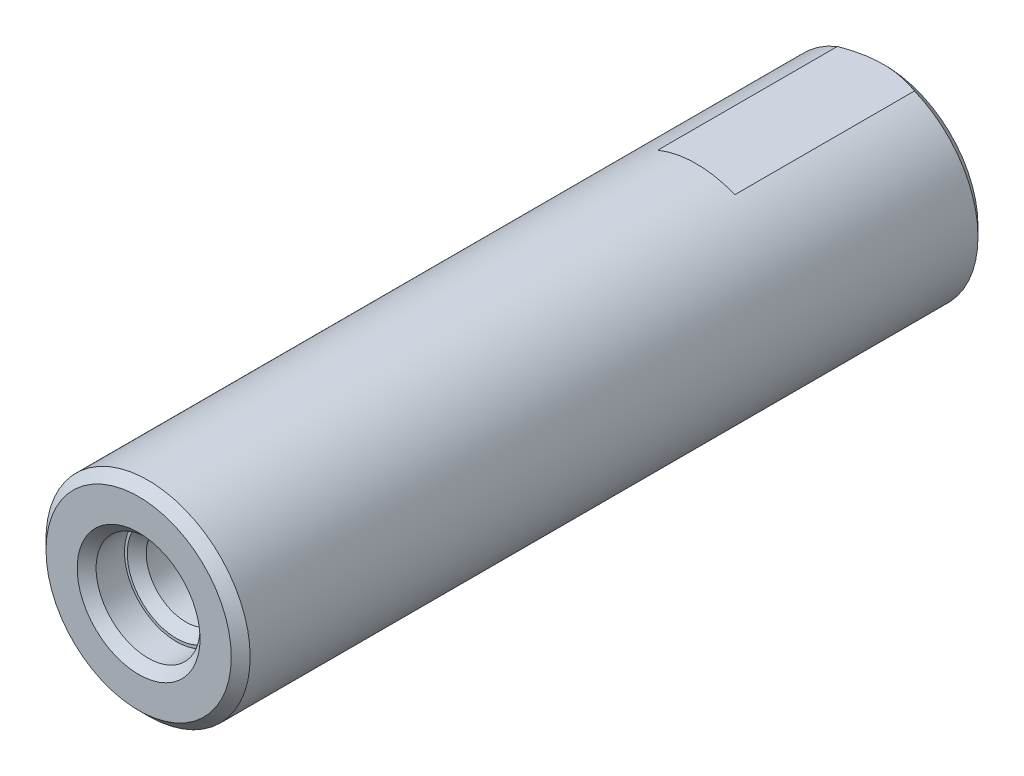
ISO-10303-21;
HEADER;
FILE_DESCRIPTION(('STEP AP214'),'2;1');
FILE_NAME('part.step','',(''),(''),'','','');
FILE_SCHEMA(('AUTOMOTIVE_DESIGN { 1 0 10303 214 1 1 1 1 }'));
ENDSEC;
DATA;
#1=APPLICATION_CONTEXT('core data for automotive mechanical design processes');
#2=APPLICATION_PROTOCOL_DEFINITION('international standard','automotive_design',2000,#1);
#3=PRODUCT_CONTEXT('',#1,'mechanical');
#4=PRODUCT('Part','Part','',(#3));
#5=PRODUCT_RELATED_PRODUCT_CATEGORY('part','',(#4));
#6=PRODUCT_DEFINITION_FORMATION('','',#4);
#7=PRODUCT_DEFINITION_CONTEXT('part definition',#1,'design');
#8=PRODUCT_DEFINITION('design','',#6,#7);
#9=PRODUCT_DEFINITION_SHAPE('','',#8);
#10=(LENGTH_UNIT() NAMED_UNIT(*) SI_UNIT(.MILLI.,.METRE.));
#11=(NAMED_UNIT(*) PLANE_ANGLE_UNIT() SI_UNIT($,.RADIAN.));
#12=(NAMED_UNIT(*) SI_UNIT($,.STERADIAN.) SOLID_ANGLE_UNIT());
#13=UNCERTAINTY_MEASURE_WITH_UNIT(LENGTH_MEASURE(1.E-05),#10,'distance_accuracy_value','');
#14=(GEOMETRIC_REPRESENTATION_CONTEXT(3) GLOBAL_UNCERTAINTY_ASSIGNED_CONTEXT((#13)) GLOBAL_UNIT_ASSIGNED_CONTEXT((#10,
#11,#12)) REPRESENTATION_CONTEXT('',''));
#15=CARTESIAN_POINT('',(0.,0.,0.));
#16=DIRECTION('',(0.,0.,1.));
#17=DIRECTION('',(1.,0.,0.));
#18=AXIS2_PLACEMENT_3D('',#15,#16,#17);
#19=CARTESIAN_POINT('',(0.,0.,39.5));
#20=DIRECTION('',(0.,0.,-1.));
#21=DIRECTION('',(-1.,0.,0.));
#22=AXIS2_PLACEMENT_3D('',#19,#20,#21);
#23=CYLINDRICAL_SURFACE('',#22,5.4);
#24=CARTESIAN_POINT('',(0.,0.,39.));
#25=DIRECTION('',(0.,0.,1.));
#26=DIRECTION('',(1.,0.,0.));
#27=AXIS2_PLACEMENT_3D('',#24,#25,#26);
#28=CIRCLE('',#27,5.4);
#29=CARTESIAN_POINT('',(5.4,0.,39.));
#30=VERTEX_POINT('',#29);
#31=EDGE_CURVE('E118',#30,#30,#28,.F.);
#32=ORIENTED_EDGE('',*,*,#31,.T.);
#33=EDGE_LOOP('',(#32));
#34=FACE_BOUND('',#33,.T.);
#35=CARTESIAN_POINT('',(0.,0.,10.));
#36=DIRECTION('',(0.,0.,1.));
#37=DIRECTION('',(1.,0.,0.));
#38=AXIS2_PLACEMENT_3D('',#35,#36,#37);
#39=CIRCLE('',#38,5.4);
#40=CARTESIAN_POINT('',(-2.03960780543711,-5.,10.));
#41=VERTEX_POINT('',#40);
#42=CARTESIAN_POINT('',(2.03960780543711,-5.,10.));
#43=VERTEX_POINT('',#42);
#44=EDGE_CURVE('E11',#41,#43,#39,.T.);
#45=ORIENTED_EDGE('',*,*,#44,.T.);
#46=DIRECTION('',(0.,0.,-1.));
#47=VECTOR('',#46,1.);
#48=CARTESIAN_POINT('',(2.03960780543711,-5.,39.5));
#49=LINE('',#48,#47);
#50=CARTESIAN_POINT('',(2.03960780543711,-5.,0.500000000000005));
#51=VERTEX_POINT('',#50);
#52=EDGE_CURVE('E90',#43,#51,#49,.T.);
#53=ORIENTED_EDGE('',*,*,#52,.T.);
#54=CARTESIAN_POINT('',(0.,0.,0.500000000000004));
#55=DIRECTION('',(0.,0.,1.));
#56=DIRECTION('',(1.,0.,0.));
#57=AXIS2_PLACEMENT_3D('',#54,#55,#56);
#58=CIRCLE('',#57,5.4);
#59=CARTESIAN_POINT('',(2.03960780543711,5.,0.500000000000004));
#60=VERTEX_POINT('',#59);
#61=EDGE_CURVE('E61',#51,#60,#58,.T.);
#62=ORIENTED_EDGE('',*,*,#61,.T.);
#63=DIRECTION('',(0.,0.,-1.));
#64=VECTOR('',#63,1.);
#65=CARTESIAN_POINT('',(2.03960780543711,5.,39.5));
#66=LINE('',#65,#64);
#67=CARTESIAN_POINT('',(2.03960780543711,5.,10.));
#68=VERTEX_POINT('',#67);
#69=EDGE_CURVE('E104',#68,#60,#66,.T.);
#70=ORIENTED_EDGE('',*,*,#69,.F.);
#71=CARTESIAN_POINT('',(0.,0.,10.));
#72=DIRECTION('',(0.,0.,1.));
#73=DIRECTION('',(1.,0.,0.));
#74=AXIS2_PLACEMENT_3D('',#71,#72,#73);
#75=CIRCLE('',#74,5.4);
#76=CARTESIAN_POINT('',(-2.03960780543711,5.,10.));
#77=VERTEX_POINT('',#76);
#78=EDGE_CURVE('E151',#68,#77,#75,.T.);
#79=ORIENTED_EDGE('',*,*,#78,.T.);
#80=DIRECTION('',(0.,0.,-1.));
#81=VECTOR('',#80,1.);
#82=CARTESIAN_POINT('',(-2.03960780543711,5.,39.5));
#83=LINE('',#82,#81);
#84=CARTESIAN_POINT('',(-2.03960780543711,5.,0.500000000000004));
#85=VERTEX_POINT('',#84);
#86=EDGE_CURVE('E102',#85,#77,#83,.F.);
#87=ORIENTED_EDGE('',*,*,#86,.F.);
#88=CARTESIAN_POINT('',(-2.03960780543711,-5.,0.500000000000004));
#89=VERTEX_POINT('',#88);
#90=EDGE_CURVE('E95',#85,#89,#58,.T.);
#91=ORIENTED_EDGE('',*,*,#90,.T.);
#92=DIRECTION('',(0.,0.,-1.));
#93=VECTOR('',#92,1.);
#94=CARTESIAN_POINT('',(-2.03960780543711,-5.,39.5));
#95=LINE('',#94,#93);
#96=EDGE_CURVE('E53',#89,#41,#95,.F.);
#97=ORIENTED_EDGE('',*,*,#96,.T.);
#98=EDGE_LOOP('',(#45,#53,#62,#70,#79,#87,#91,#97));
#99=FACE_BOUND('',#98,.T.);
#100=ADVANCED_FACE('F38',(#34,#99),#23,.T.);
#101=CARTESIAN_POINT('',(0.,0.,0.500000000000004));
#102=DIRECTION('',(0.,0.,1.));
#103=DIRECTION('',(1.,0.,0.));
#104=AXIS2_PLACEMENT_3D('',#101,#102,#103);
#105=CONICAL_SURFACE('',#104,5.4,0.78539816339745);
#106=CARTESIAN_POINT('',(-3.55844793750582,-5.,1.23698229783494));
#107=CARTESIAN_POINT('',(-3.46862853281629,-5.,1.18490731578521));
#108=CARTESIAN_POINT('',(-3.37824708377922,-5.,1.13380360024076));
#109=CARTESIAN_POINT('',(-3.19623728614932,-5.,1.03381290104912));
#110=CARTESIAN_POINT('',(-3.10460862260931,-5.,0.984926491343645));
#111=CARTESIAN_POINT('',(-2.82702617390308,-5.,0.841677345323222));
#112=CARTESIAN_POINT('',(-2.63906658882332,-5.,0.751130536360762));
#113=CARTESIAN_POINT('',(-2.2542695508479,-5.,0.581916277053992));
#114=CARTESIAN_POINT('',(-2.05733888313538,-5.,0.503458458257279));
#115=CARTESIAN_POINT('',(-1.65751480131661,-5.,0.364256266708928));
#116=CARTESIAN_POINT('',(-1.45463196493869,-5.,0.303482344961023));
#117=CARTESIAN_POINT('',(-1.1246661128785,-5.,0.223502518929508));
#118=CARTESIAN_POINT('',(-0.999254136032922,-5.,0.197356244040857));
#119=CARTESIAN_POINT('',(-0.746871571155798,-5.,0.153946873610009));
#120=CARTESIAN_POINT('',(-0.619900907762319,-5.,0.136684209332924));
#121=CARTESIAN_POINT('',(-0.366074762066631,-5.,0.111805570168607));
#122=CARTESIAN_POINT('',(-0.239227094519322,-5.,0.10411060550821));
#123=CARTESIAN_POINT('',(0.0146882198085563,-5.,0.0984099621337339));
#124=CARTESIAN_POINT('',(0.141755871556907,-5.,0.100404505162544));
#125=CARTESIAN_POINT('',(0.414831894586561,-5.,0.115054400963582));
#126=CARTESIAN_POINT('',(0.560756443216524,-5.,0.129297800581305));
#127=CARTESIAN_POINT('',(0.850917867372854,-5.,0.169851883898827));
#128=CARTESIAN_POINT('',(0.995154397995769,-5.,0.196164991066866));
#129=CARTESIAN_POINT('',(1.28296336382971,-5.,0.260043725859942));
#130=CARTESIAN_POINT('',(1.42650538133624,-5.,0.297744851612287));
#131=CARTESIAN_POINT('',(1.7106338804291,-5.,0.382791524768694));
#132=CARTESIAN_POINT('',(1.85122096385268,-5.,0.43013508686298));
#133=CARTESIAN_POINT('',(2.17064155139046,-5.,0.548264489050554));
#134=CARTESIAN_POINT('',(2.34843963453477,-5.,0.621837222432528));
#135=CARTESIAN_POINT('',(2.69916966120001,-5.,0.779875127886667));
#136=CARTESIAN_POINT('',(2.87209891120534,-5.,0.864346190248948));
#137=CARTESIAN_POINT('',(3.21409157523968,-5.,1.04213553536569));
#138=CARTESIAN_POINT('',(3.38313912228282,-5.,1.1354841027797));
#139=CARTESIAN_POINT('',(3.71726244007845,-5.,1.32892384637746));
#140=CARTESIAN_POINT('',(3.88233894061284,-5.,1.429013770616));
#141=CARTESIAN_POINT('',(4.20141944792185,-5.,1.6297230724747));
#142=CARTESIAN_POINT('',(4.35557911866461,-5.,1.73009626769985));
#143=CARTESIAN_POINT('',(4.66125946164193,-5.,1.93479801264583));
#144=CARTESIAN_POINT('',(4.81277991763842,-5.,2.03912688426202));
#145=CARTESIAN_POINT('',(5.11224654466352,-5.,2.2500941666337));
#146=CARTESIAN_POINT('',(5.2602122658097,-5.,2.35670492382206));
#147=CARTESIAN_POINT('',(5.55416329412854,-5.,2.57254212643724));
#148=CARTESIAN_POINT('',(5.70014913316774,-5.,2.68176784668034));
#149=CARTESIAN_POINT('',(5.84531484286475,-5.,2.7920547067877));
#150=B_SPLINE_CURVE_WITH_KNOTS('',3,(#106,#107,#108,#109,#110,#111,#112,#113,#114,#115,#116,
#117,#118,#119,#120,#121,#122,#123,#124,#125,#126,#127,#128,#129,#130,#131,#132,#133,#134,#135,
#136,#137,#138,#139,#140,#141,#142,#143,#144,#145,#146,#147,#148,#149),.UNSPECIFIED.,.F.,.F.,(4,
2,2,2,2,2,2,2,2,2,2,2,2,2,2,2,2,2,2,2,2,4),(0.,0.31145870764884,0.622997580473992,
1.2484757186856,1.88380812576862,2.51807274309482,2.90212477400917,3.28619544741343,
3.66707375996795,4.04796078890492,4.48726123245069,4.92664992146676,5.3714875598596,
5.81623370173471,6.39300615892288,6.97009166426403,7.54922173529123,8.1282445503775,
8.68004167511713,9.23188379943467,9.77896995199092,10.3259061044887),.UNSPECIFIED.);
#151=EDGE_CURVE('E46',#89,#51,#150,.T.);
#152=ORIENTED_EDGE('',*,*,#151,.F.);
#153=ORIENTED_EDGE('',*,*,#90,.F.);
#154=CARTESIAN_POINT('',(-3.55844793750582,5.,1.23698229783494));
#155=CARTESIAN_POINT('',(-3.46862853281629,5.,1.18490731578521));
#156=CARTESIAN_POINT('',(-3.37824708377922,5.,1.13380360024076));
#157=CARTESIAN_POINT('',(-3.19623728614932,5.,1.03381290104912));
#158=CARTESIAN_POINT('',(-3.10460862260931,5.,0.984926491343645));
#159=CARTESIAN_POINT('',(-2.82702617390308,5.,0.841677345323222));
#160=CARTESIAN_POINT('',(-2.63906658882332,5.,0.751130536360762));
#161=CARTESIAN_POINT('',(-2.2542695508479,5.,0.581916277053992));
#162=CARTESIAN_POINT('',(-2.05733888313538,5.,0.503458458257279));
#163=CARTESIAN_POINT('',(-1.65751480131661,5.,0.364256266708928));
#164=CARTESIAN_POINT('',(-1.45463196493869,5.,0.303482344961023));
#165=CARTESIAN_POINT('',(-1.1246661128785,5.,0.223502518929508));
#166=CARTESIAN_POINT('',(-0.999254136032922,5.,0.197356244040857));
#167=CARTESIAN_POINT('',(-0.746871571155798,5.,0.153946873610009));
#168=CARTESIAN_POINT('',(-0.619900907762319,5.,0.136684209332924));
#169=CARTESIAN_POINT('',(-0.366074762066631,5.,0.111805570168607));
#170=CARTESIAN_POINT('',(-0.239227094519322,5.,0.10411060550821));
#171=CARTESIAN_POINT('',(0.0146882198085563,5.,0.0984099621337339));
#172=CARTESIAN_POINT('',(0.141755871556907,5.,0.100404505162544));
#173=CARTESIAN_POINT('',(0.414831894586561,5.,0.115054400963582));
#174=CARTESIAN_POINT('',(0.560756443216524,5.,0.129297800581305));
#175=CARTESIAN_POINT('',(0.850917867372854,5.,0.169851883898827));
#176=CARTESIAN_POINT('',(0.995154397995769,5.,0.196164991066866));
#177=CARTESIAN_POINT('',(1.28296336382971,5.,0.260043725859942));
#178=CARTESIAN_POINT('',(1.42650538133624,5.,0.297744851612287));
#179=CARTESIAN_POINT('',(1.7106338804291,5.,0.382791524768694));
#180=CARTESIAN_POINT('',(1.85122096385268,5.,0.43013508686298));
#181=CARTESIAN_POINT('',(2.17064155139046,5.,0.548264489050554));
#182=CARTESIAN_POINT('',(2.34843963453477,5.,0.621837222432528));
#183=CARTESIAN_POINT('',(2.69916966120001,5.,0.779875127886667));
#184=CARTESIAN_POINT('',(2.87209891120534,5.,0.864346190248948));
#185=CARTESIAN_POINT('',(3.21409157523968,5.,1.04213553536569));
#186=CARTESIAN_POINT('',(3.38313912228282,5.,1.1354841027797));
#187=CARTESIAN_POINT('',(3.71726244007845,5.,1.32892384637746));
#188=CARTESIAN_POINT('',(3.88233894061284,5.,1.429013770616));
#189=CARTESIAN_POINT('',(4.20141944792185,5.,1.6297230724747));
#190=CARTESIAN_POINT('',(4.35557911866461,5.,1.73009626769985));
#191=CARTESIAN_POINT('',(4.66125946164193,5.,1.93479801264583));
#192=CARTESIAN_POINT('',(4.81277991763842,5.,2.03912688426202));
#193=CARTESIAN_POINT('',(5.11224654466352,5.,2.2500941666337));
#194=CARTESIAN_POINT('',(5.2602122658097,5.,2.35670492382206));
#195=CARTESIAN_POINT('',(5.55416329412854,5.,2.57254212643724));
#196=CARTESIAN_POINT('',(5.70014913316774,5.,2.68176784668034));
#197=CARTESIAN_POINT('',(5.84531484286475,5.,2.7920547067877));
#198=B_SPLINE_CURVE_WITH_KNOTS('',3,(#154,#155,#156,#157,#158,#159,#160,#161,#162,#163,#164,
#165,#166,#167,#168,#169,#170,#171,#172,#173,#174,#175,#176,#177,#178,#179,#180,#181,#182,#183,
#184,#185,#186,#187,#188,#189,#190,#191,#192,#193,#194,#195,#196,#197),.UNSPECIFIED.,.F.,.F.,(4,
2,2,2,2,2,2,2,2,2,2,2,2,2,2,2,2,2,2,2,2,4),(0.,0.31145870764884,0.622997580473992,
1.2484757186856,1.88380812576862,2.51807274309482,2.90212477400917,3.28619544741343,
3.66707375996795,4.04796078890492,4.48726123245069,4.92664992146676,5.3714875598596,
5.81623370173471,6.39300615892288,6.97009166426403,7.54922173529123,8.1282445503775,
8.68004167511713,9.23188379943467,9.77896995199092,10.3259061044887),.UNSPECIFIED.);
#199=EDGE_CURVE('E143',#85,#60,#198,.T.);
#200=ORIENTED_EDGE('',*,*,#199,.T.);
#201=ORIENTED_EDGE('',*,*,#61,.F.);
#202=EDGE_LOOP('',(#152,#153,#200,#201));
#203=FACE_BOUND('',#202,.T.);
#204=CARTESIAN_POINT('',(0.,0.,0.));
#205=DIRECTION('',(0.,0.,1.));
#206=DIRECTION('',(1.,0.,0.));
#207=AXIS2_PLACEMENT_3D('',#204,#205,#206);
#208=CIRCLE('',#207,4.9);
#209=CARTESIAN_POINT('',(4.9,0.,0.));
#210=VERTEX_POINT('',#209);
#211=EDGE_CURVE('E134',#210,#210,#208,.F.);
#212=ORIENTED_EDGE('',*,*,#211,.F.);
#213=EDGE_LOOP('',(#212));
#214=FACE_BOUND('',#213,.T.);
#215=ADVANCED_FACE('F152',(#203,#214),#105,.T.);
#216=CARTESIAN_POINT('',(0.,0.,39.5));
#217=DIRECTION('',(0.,0.,1.));
#218=DIRECTION('',(1.,0.,0.));
#219=AXIS2_PLACEMENT_3D('',#216,#217,#218);
#220=PLANE('',#219);
#221=CARTESIAN_POINT('',(0.,0.,39.5));
#222=DIRECTION('',(0.,0.,1.));
#223=DIRECTION('',(1.,0.,0.));
#224=AXIS2_PLACEMENT_3D('',#221,#222,#223);
#225=CIRCLE('',#224,3.25000000000001);
#226=CARTESIAN_POINT('',(3.25,0.,39.5));
#227=VERTEX_POINT('',#226);
#228=EDGE_CURVE('E124',#227,#227,#225,.F.);
#229=ORIENTED_EDGE('',*,*,#228,.T.);
#230=EDGE_LOOP('',(#229));
#231=FACE_BOUND('',#230,.T.);
#232=CARTESIAN_POINT('',(0.,0.,39.5));
#233=DIRECTION('',(0.,0.,1.));
#234=DIRECTION('',(1.,0.,0.));
#235=AXIS2_PLACEMENT_3D('',#232,#233,#234);
#236=CIRCLE('',#235,4.9);
#237=CARTESIAN_POINT('',(4.9,0.,39.5));
#238=VERTEX_POINT('',#237);
#239=EDGE_CURVE('E115',#238,#238,#236,.T.);
#240=ORIENTED_EDGE('',*,*,#239,.T.);
#241=EDGE_LOOP('',(#240));
#242=FACE_BOUND('',#241,.T.);
#243=ADVANCED_FACE('F190',(#231,#242),#220,.T.);
#244=CARTESIAN_POINT('',(0.,0.,0.));
#245=DIRECTION('',(0.,0.,1.));
#246=DIRECTION('',(1.,0.,0.));
#247=AXIS2_PLACEMENT_3D('',#244,#245,#246);
#248=PLANE('',#247);
#249=CARTESIAN_POINT('',(0.,0.,0.));
#250=DIRECTION('',(0.,0.,1.));
#251=DIRECTION('',(1.,0.,0.));
#252=AXIS2_PLACEMENT_3D('',#249,#250,#251);
#253=CIRCLE('',#252,2.6);
#254=CARTESIAN_POINT('',(2.6,0.,0.));
#255=VERTEX_POINT('',#254);
#256=EDGE_CURVE('E140',#255,#255,#253,.T.);
#257=ORIENTED_EDGE('',*,*,#256,.T.);
#258=EDGE_LOOP('',(#257));
#259=FACE_BOUND('',#258,.T.);
#260=ORIENTED_EDGE('',*,*,#211,.T.);
#261=EDGE_LOOP('',(#260));
#262=FACE_BOUND('',#261,.T.);
#263=ADVANCED_FACE('F193',(#259,#262),#248,.F.);
#264=CARTESIAN_POINT('',(0.,0.,39.5));
#265=DIRECTION('',(0.,0.,-1.));
#266=DIRECTION('',(-1.,0.,0.));
#267=AXIS2_PLACEMENT_3D('',#264,#265,#266);
#268=CONICAL_SURFACE('',#267,4.9,0.785398163397446);
#269=ORIENTED_EDGE('',*,*,#31,.F.);
#270=EDGE_LOOP('',(#269));
#271=FACE_BOUND('',#270,.T.);
#272=ORIENTED_EDGE('',*,*,#239,.F.);
#273=EDGE_LOOP('',(#272));
#274=FACE_BOUND('',#273,.T.);
#275=ADVANCED_FACE('F176',(#271,#274),#268,.T.);
#276=CARTESIAN_POINT('',(0.,0.,37.5));
#277=DIRECTION('',(0.,0.,1.));
#278=DIRECTION('',(1.,0.,0.));
#279=AXIS2_PLACEMENT_3D('',#276,#277,#278);
#280=PLANE('',#279);
#281=CARTESIAN_POINT('',(0.,0.,37.5));
#282=DIRECTION('',(0.,0.,1.));
#283=DIRECTION('',(1.,0.,0.));
#284=AXIS2_PLACEMENT_3D('',#281,#282,#283);
#285=CIRCLE('',#284,2.6);
#286=CARTESIAN_POINT('',(2.6,0.,37.5));
#287=VERTEX_POINT('',#286);
#288=EDGE_CURVE('E127',#287,#287,#285,.F.);
#289=ORIENTED_EDGE('',*,*,#288,.T.);
#290=EDGE_LOOP('',(#289));
#291=FACE_BOUND('',#290,.T.);
#292=CARTESIAN_POINT('',(0.,0.,37.5));
#293=DIRECTION('',(0.,0.,1.));
#294=DIRECTION('',(1.,0.,0.));
#295=AXIS2_PLACEMENT_3D('',#292,#293,#294);
#296=CIRCLE('',#295,2.75);
#297=CARTESIAN_POINT('',(2.75,0.,37.5));
#298=VERTEX_POINT('',#297);
#299=EDGE_CURVE('E109',#298,#298,#296,.T.);
#300=ORIENTED_EDGE('',*,*,#299,.T.);
#301=EDGE_LOOP('',(#300));
#302=FACE_BOUND('',#301,.T.);
#303=ADVANCED_FACE('F172',(#291,#302),#280,.T.);
#304=CARTESIAN_POINT('',(0.,0.,37.5));
#305=DIRECTION('',(0.,0.,1.));
#306=DIRECTION('',(1.,0.,0.));
#307=AXIS2_PLACEMENT_3D('',#304,#305,#306);
#308=CYLINDRICAL_SURFACE('',#307,2.75);
#309=CARTESIAN_POINT('',(0.,0.,39.));
#310=DIRECTION('',(0.,0.,1.));
#311=DIRECTION('',(1.,0.,0.));
#312=AXIS2_PLACEMENT_3D('',#309,#310,#311);
#313=CIRCLE('',#312,2.75);
#314=CARTESIAN_POINT('',(2.75,0.,39.));
#315=VERTEX_POINT('',#314);
#316=EDGE_CURVE('E121',#315,#315,#313,.T.);
#317=ORIENTED_EDGE('',*,*,#316,.T.);
#318=EDGE_LOOP('',(#317));
#319=FACE_BOUND('',#318,.T.);
#320=ORIENTED_EDGE('',*,*,#299,.F.);
#321=EDGE_LOOP('',(#320));
#322=FACE_BOUND('',#321,.T.);
#323=ADVANCED_FACE('F175',(#319,#322),#308,.F.);
#324=CARTESIAN_POINT('',(0.,0.,27.1));
#325=DIRECTION('',(0.,0.,1.));
#326=DIRECTION('',(1.,0.,0.));
#327=AXIS2_PLACEMENT_3D('',#324,#325,#326);
#328=CONICAL_SURFACE('',#327,2.1,1.02974425867665);
#329=CARTESIAN_POINT('',(0.,0.,25.8381927000421));
#330=VERTEX_POINT('',#329);
#331=VERTEX_LOOP('',#330);
#332=FACE_BOUND('',#331,.T.);
#333=CARTESIAN_POINT('',(0.,0.,27.1));
#334=DIRECTION('',(0.,0.,1.));
#335=DIRECTION('',(1.,0.,0.));
#336=AXIS2_PLACEMENT_3D('',#333,#334,#335);
#337=CIRCLE('',#336,2.1);
#338=CARTESIAN_POINT('',(2.1,0.,27.1));
#339=VERTEX_POINT('',#338);
#340=EDGE_CURVE('E112',#339,#339,#337,.T.);
#341=ORIENTED_EDGE('',*,*,#340,.T.);
#342=EDGE_LOOP('',(#341));
#343=FACE_BOUND('',#342,.T.);
#344=ADVANCED_FACE('F180',(#332,#343),#328,.F.);
#345=CARTESIAN_POINT('',(0.,0.,39.5));
#346=DIRECTION('',(0.,0.,1.));
#347=DIRECTION('',(1.,0.,0.));
#348=AXIS2_PLACEMENT_3D('',#345,#346,#347);
#349=CYLINDRICAL_SURFACE('',#348,2.1);
#350=CARTESIAN_POINT('',(0.,0.,37.));
#351=DIRECTION('',(0.,0.,1.));
#352=DIRECTION('',(1.,0.,0.));
#353=AXIS2_PLACEMENT_3D('',#350,#351,#352);
#354=CIRCLE('',#353,2.1);
#355=CARTESIAN_POINT('',(2.1,0.,37.));
#356=VERTEX_POINT('',#355);
#357=EDGE_CURVE('E130',#356,#356,#354,.T.);
#358=ORIENTED_EDGE('',*,*,#357,.T.);
#359=EDGE_LOOP('',(#358));
#360=FACE_BOUND('',#359,.T.);
#361=ORIENTED_EDGE('',*,*,#340,.F.);
#362=EDGE_LOOP('',(#361));
#363=FACE_BOUND('',#362,.T.);
#364=ADVANCED_FACE('F182',(#360,#363),#349,.F.);
#365=CARTESIAN_POINT('',(0.,0.,39.));
#366=DIRECTION('',(0.,0.,1.));
#367=DIRECTION('',(1.,0.,0.));
#368=AXIS2_PLACEMENT_3D('',#365,#366,#367);
#369=CONICAL_SURFACE('',#368,2.75,0.785398163397448);
#370=ORIENTED_EDGE('',*,*,#228,.F.);
#371=EDGE_LOOP('',(#370));
#372=FACE_BOUND('',#371,.T.);
#373=ORIENTED_EDGE('',*,*,#316,.F.);
#374=EDGE_LOOP('',(#373));
#375=FACE_BOUND('',#374,.T.);
#376=ADVANCED_FACE('F185',(#372,#375),#369,.F.);
#377=CARTESIAN_POINT('',(0.,0.,37.5));
#378=DIRECTION('',(0.,0.,1.));
#379=DIRECTION('',(1.,0.,0.));
#380=AXIS2_PLACEMENT_3D('',#377,#378,#379);
#381=CONICAL_SURFACE('',#380,2.6,0.785398163397444);
#382=ORIENTED_EDGE('',*,*,#357,.F.);
#383=EDGE_LOOP('',(#382));
#384=FACE_BOUND('',#383,.T.);
#385=ORIENTED_EDGE('',*,*,#288,.F.);
#386=EDGE_LOOP('',(#385));
#387=FACE_BOUND('',#386,.T.);
#388=ADVANCED_FACE('F170',(#384,#387),#381,.F.);
#389=CARTESIAN_POINT('',(0.,0.,12.4));
#390=DIRECTION('',(0.,0.,-1.));
#391=DIRECTION('',(-1.,0.,0.));
#392=AXIS2_PLACEMENT_3D('',#389,#390,#391);
#393=CONICAL_SURFACE('',#392,2.1,1.02974425867665);
#394=CARTESIAN_POINT('',(0.,0.,13.6618072999579));
#395=VERTEX_POINT('',#394);
#396=VERTEX_LOOP('',#395);
#397=FACE_BOUND('',#396,.T.);
#398=CARTESIAN_POINT('',(0.,0.,12.4));
#399=DIRECTION('',(0.,0.,-1.));
#400=DIRECTION('',(-1.,0.,0.));
#401=AXIS2_PLACEMENT_3D('',#398,#399,#400);
#402=CIRCLE('',#401,2.1);
#403=CARTESIAN_POINT('',(-2.1,0.,12.4));
#404=VERTEX_POINT('',#403);
#405=EDGE_CURVE('E106',#404,#404,#402,.T.);
#406=ORIENTED_EDGE('',*,*,#405,.T.);
#407=EDGE_LOOP('',(#406));
#408=FACE_BOUND('',#407,.T.);
#409=ADVANCED_FACE('F166',(#397,#408),#393,.F.);
#410=CARTESIAN_POINT('',(0.,0.,0.));
#411=DIRECTION('',(0.,0.,-1.));
#412=DIRECTION('',(-1.,0.,0.));
#413=AXIS2_PLACEMENT_3D('',#410,#411,#412);
#414=CYLINDRICAL_SURFACE('',#413,2.1);
#415=CARTESIAN_POINT('',(0.,0.,0.500000000000005));
#416=DIRECTION('',(0.,0.,1.));
#417=DIRECTION('',(1.,0.,0.));
#418=AXIS2_PLACEMENT_3D('',#415,#416,#417);
#419=CIRCLE('',#418,2.1);
#420=CARTESIAN_POINT('',(2.1,0.,0.500000000000005));
#421=VERTEX_POINT('',#420);
#422=EDGE_CURVE('E137',#421,#421,#419,.F.);
#423=ORIENTED_EDGE('',*,*,#422,.T.);
#424=EDGE_LOOP('',(#423));
#425=FACE_BOUND('',#424,.T.);
#426=ORIENTED_EDGE('',*,*,#405,.F.);
#427=EDGE_LOOP('',(#426));
#428=FACE_BOUND('',#427,.T.);
#429=ADVANCED_FACE('F163',(#425,#428),#414,.F.);
#430=CARTESIAN_POINT('',(0.,0.,0.500000000000005));
#431=DIRECTION('',(0.,0.,-1.));
#432=DIRECTION('',(-1.,0.,0.));
#433=AXIS2_PLACEMENT_3D('',#430,#431,#432);
#434=CONICAL_SURFACE('',#433,2.1,0.78539816339745);
#435=ORIENTED_EDGE('',*,*,#256,.F.);
#436=EDGE_LOOP('',(#435));
#437=FACE_BOUND('',#436,.T.);
#438=ORIENTED_EDGE('',*,*,#422,.F.);
#439=EDGE_LOOP('',(#438));
#440=FACE_BOUND('',#439,.T.);
#441=ADVANCED_FACE('F40',(#437,#440),#434,.F.);
#442=CARTESIAN_POINT('',(-5.,5.,10.));
#443=DIRECTION('',(0.,0.,1.));
#444=DIRECTION('',(1.,0.,0.));
#445=AXIS2_PLACEMENT_3D('',#442,#443,#444);
#446=PLANE('',#445);
#447=DIRECTION('',(1.,0.,0.));
#448=VECTOR('',#447,1.);
#449=CARTESIAN_POINT('',(-5.,5.,10.));
#450=LINE('',#449,#448);
#451=EDGE_CURVE('E97',#77,#68,#450,.T.);
#452=ORIENTED_EDGE('',*,*,#451,.F.);
#453=ORIENTED_EDGE('',*,*,#78,.F.);
#454=EDGE_LOOP('',(#452,#453));
#455=FACE_BOUND('',#454,.T.);
#456=ADVANCED_FACE('F160',(#455),#446,.F.);
#457=CARTESIAN_POINT('',(-5.,5.,10.));
#458=DIRECTION('',(0.,1.,0.));
#459=DIRECTION('',(0.,0.,1.));
#460=AXIS2_PLACEMENT_3D('',#457,#458,#459);
#461=PLANE('',#460);
#462=ORIENTED_EDGE('',*,*,#69,.T.);
#463=ORIENTED_EDGE('',*,*,#199,.F.);
#464=ORIENTED_EDGE('',*,*,#86,.T.);
#465=ORIENTED_EDGE('',*,*,#451,.T.);
#466=EDGE_LOOP('',(#462,#463,#464,#465));
#467=FACE_BOUND('',#466,.T.);
#468=ADVANCED_FACE('F155',(#467),#461,.T.);
#469=CARTESIAN_POINT('',(-5.,-5.,10.));
#470=DIRECTION('',(0.,0.,1.));
#471=DIRECTION('',(1.,0.,0.));
#472=AXIS2_PLACEMENT_3D('',#469,#470,#471);
#473=PLANE('',#472);
#474=DIRECTION('',(1.,0.,0.));
#475=VECTOR('',#474,1.);
#476=CARTESIAN_POINT('',(-5.,-5.,10.));
#477=LINE('',#476,#475);
#478=EDGE_CURVE('E88',#41,#43,#477,.T.);
#479=ORIENTED_EDGE('',*,*,#478,.T.);
#480=ORIENTED_EDGE('',*,*,#44,.F.);
#481=EDGE_LOOP('',(#479,#480));
#482=FACE_BOUND('',#481,.T.);
#483=ADVANCED_FACE('F87',(#482),#473,.F.);
#484=CARTESIAN_POINT('',(-5.,-5.,10.));
#485=DIRECTION('',(0.,1.,0.));
#486=DIRECTION('',(0.,0.,1.));
#487=AXIS2_PLACEMENT_3D('',#484,#485,#486);
#488=PLANE('',#487);
#489=ORIENTED_EDGE('',*,*,#478,.F.);
#490=ORIENTED_EDGE('',*,*,#96,.F.);
#491=ORIENTED_EDGE('',*,*,#151,.T.);
#492=ORIENTED_EDGE('',*,*,#52,.F.);
#493=EDGE_LOOP('',(#489,#490,#491,#492));
#494=FACE_BOUND('',#493,.T.);
#495=ADVANCED_FACE('F89',(#494),#488,.F.);
#496=CLOSED_SHELL('',(#100,#215,#243,#263,#275,#303,#323,#344,#364,#376,#388,#409,#429,#441,
#456,#468,#483,#495));
#497=MANIFOLD_SOLID_BREP('B2',#496);
#498=ADVANCED_BREP_SHAPE_REPRESENTATION('',(#18,#497),#14);
#499=SHAPE_DEFINITION_REPRESENTATION(#9,#498);
ENDSEC;
END-ISO-10303-21;
